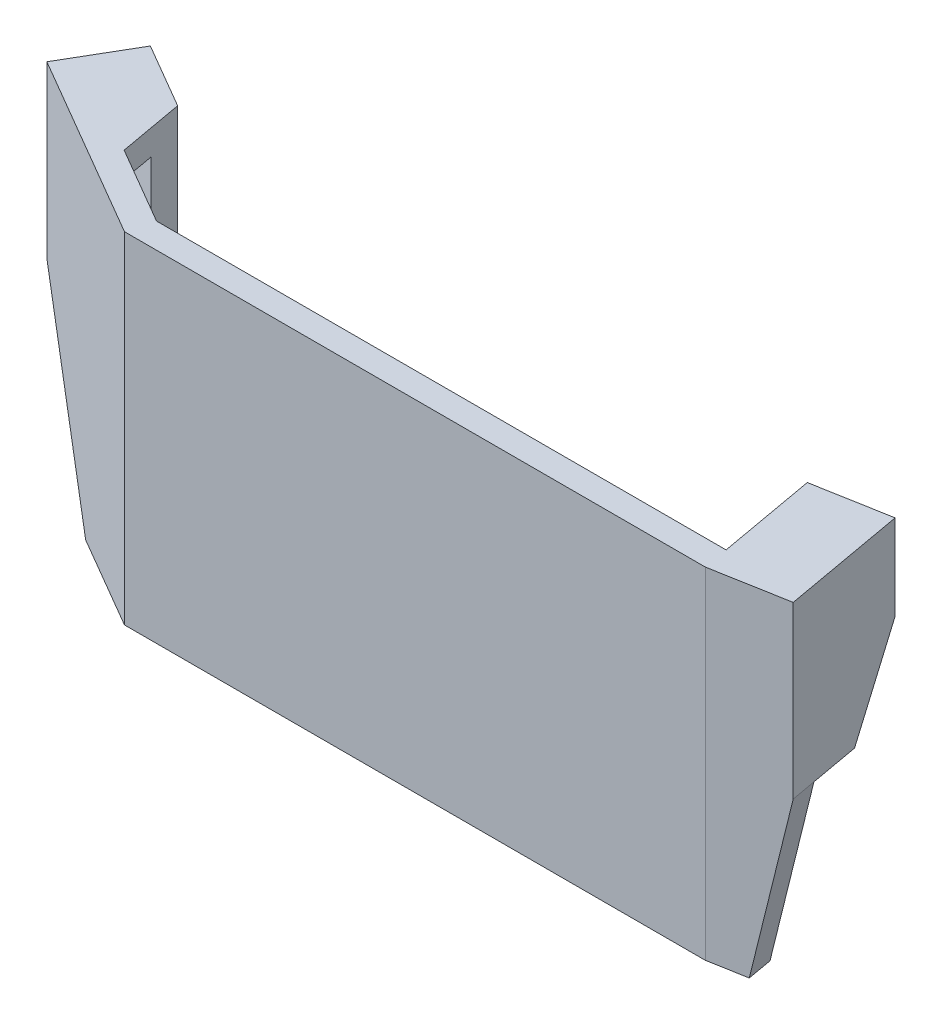
ISO-10303-21;
HEADER;
FILE_DESCRIPTION(('STEP AP214'),'2;1');
FILE_NAME('part.step','',(''),(''),'','','');
FILE_SCHEMA(('AUTOMOTIVE_DESIGN { 1 0 10303 214 1 1 1 1 }'));
ENDSEC;
DATA;
#1=APPLICATION_CONTEXT('core data for automotive mechanical design processes');
#2=APPLICATION_PROTOCOL_DEFINITION('international standard','automotive_design',2000,#1);
#3=PRODUCT_CONTEXT('',#1,'mechanical');
#4=PRODUCT('Part','Part','',(#3));
#5=PRODUCT_RELATED_PRODUCT_CATEGORY('part','',(#4));
#6=PRODUCT_DEFINITION_FORMATION('','',#4);
#7=PRODUCT_DEFINITION_CONTEXT('part definition',#1,'design');
#8=PRODUCT_DEFINITION('design','',#6,#7);
#9=PRODUCT_DEFINITION_SHAPE('','',#8);
#10=(LENGTH_UNIT() NAMED_UNIT(*) SI_UNIT(.MILLI.,.METRE.));
#11=(NAMED_UNIT(*) PLANE_ANGLE_UNIT() SI_UNIT($,.RADIAN.));
#12=(NAMED_UNIT(*) SI_UNIT($,.STERADIAN.) SOLID_ANGLE_UNIT());
#13=UNCERTAINTY_MEASURE_WITH_UNIT(LENGTH_MEASURE(1.E-05),#10,'distance_accuracy_value','');
#14=(GEOMETRIC_REPRESENTATION_CONTEXT(3) GLOBAL_UNCERTAINTY_ASSIGNED_CONTEXT((#13)) GLOBAL_UNIT_ASSIGNED_CONTEXT((#10,
#11,#12)) REPRESENTATION_CONTEXT('',''));
#15=CARTESIAN_POINT('',(0.,0.,0.));
#16=DIRECTION('',(0.,0.,1.));
#17=DIRECTION('',(1.,0.,0.));
#18=AXIS2_PLACEMENT_3D('',#15,#16,#17);
#19=CARTESIAN_POINT('',(0.,-2.,0.));
#20=DIRECTION('',(0.,-1.,0.));
#21=DIRECTION('',(0.,0.,-1.));
#22=AXIS2_PLACEMENT_3D('',#19,#20,#21);
#23=PLANE('',#22);
#24=DIRECTION('',(-0.50344570110163,0.,0.864026866504907));
#25=VECTOR('',#24,1.);
#26=CARTESIAN_POINT('',(-34.7487526832088,-2.,-13.7751158130893));
#27=LINE('',#26,#25);
#28=CARTESIAN_POINT('',(-35.7556440854121,-2.,-12.0470620800794));
#29=VERTEX_POINT('',#28);
#30=CARTESIAN_POINT('',(-36.7625354876154,-2.,-10.3190083470696));
#31=VERTEX_POINT('',#30);
#32=EDGE_CURVE('E304',#29,#31,#27,.T.);
#33=ORIENTED_EDGE('',*,*,#32,.F.);
#34=DIRECTION('',(-0.864026866504906,0.,-0.503445701101632));
#35=VECTOR('',#34,1.);
#36=CARTESIAN_POINT('',(-35.7556440854121,-2.,-12.0470620800794));
#37=LINE('',#36,#35);
#38=CARTESIAN_POINT('',(-29.1011783824715,-2.,-8.16968015927702));
#39=VERTEX_POINT('',#38);
#40=EDGE_CURVE('E365',#39,#29,#37,.T.);
#41=ORIENTED_EDGE('',*,*,#40,.F.);
#42=DIRECTION('',(-0.176472793536462,0.,-0.984305518191094));
#43=VECTOR('',#42,1.);
#44=CARTESIAN_POINT('',(-29.5645914841794,-2.,-10.7544416064795));
#45=LINE('',#44,#43);
#46=CARTESIAN_POINT('',(-28.6377652807636,-2.,-5.58491871207465));
#47=VERTEX_POINT('',#46);
#48=EDGE_CURVE('E261',#47,#39,#45,.T.);
#49=ORIENTED_EDGE('',*,*,#48,.F.);
#50=DIRECTION('',(0.864026866504909,0.,0.503445701101626));
#51=VECTOR('',#50,1.);
#52=CARTESIAN_POINT('',(-22.4852326944472,-2.,-1.9999999999999));
#53=LINE('',#52,#51);
#54=EDGE_CURVE('E329',#31,#47,#53,.T.);
#55=ORIENTED_EDGE('',*,*,#54,.F.);
#56=EDGE_LOOP('',(#33,#41,#49,#55));
#57=FACE_BOUND('',#56,.T.);
#58=ADVANCED_FACE('F45',(#57),#23,.T.);
#59=DIRECTION('',(-0.984305518191093,0.,0.176472793536464));
#60=VECTOR('',#59,1.);
#61=CARTESIAN_POINT('',(27.1665078734454,-2.,-10.9018919431298));
#62=LINE('',#61,#60);
#63=CARTESIAN_POINT('',(25.1978968370632,-2.,-10.5489463560569));
#64=VERTEX_POINT('',#63);
#65=CARTESIAN_POINT('',(23.229285800681,-2.,-10.1960007689839));
#66=VERTEX_POINT('',#65);
#67=EDGE_CURVE('E300',#64,#66,#62,.T.);
#68=ORIENTED_EDGE('',*,*,#67,.F.);
#69=DIRECTION('',(-0.176472793536465,0.,-0.984305518191093));
#70=VECTOR('',#69,1.);
#71=CARTESIAN_POINT('',(25.1978968370632,-2.,-10.5489463560569));
#72=LINE('',#71,#70);
#73=CARTESIAN_POINT('',(26.6040515650291,-2.,-2.7058911721351));
#74=VERTEX_POINT('',#73);
#75=EDGE_CURVE('E360',#74,#64,#72,.T.);
#76=ORIENTED_EDGE('',*,*,#75,.F.);
#77=DIRECTION('',(0.984305518191093,0.,-0.176472793536463));
#78=VECTOR('',#77,1.);
#79=CARTESIAN_POINT('',(28.5726626014113,-2.,-3.05883675920802));
#80=LINE('',#79,#78);
#81=CARTESIAN_POINT('',(24.6354405286469,-2.,-2.35294558506218));
#82=VERTEX_POINT('',#81);
#83=EDGE_CURVE('E320',#82,#74,#80,.T.);
#84=ORIENTED_EDGE('',*,*,#83,.F.);
#85=DIRECTION('',(0.176472793536464,0.,0.984305518191093));
#86=VECTOR('',#85,1.);
#87=CARTESIAN_POINT('',(23.229285800681,-2.,-10.1960007689839));
#88=LINE('',#87,#86);
#89=EDGE_CURVE('E325',#66,#82,#88,.T.);
#90=ORIENTED_EDGE('',*,*,#89,.F.);
#91=EDGE_LOOP('',(#68,#76,#84,#90));
#92=FACE_BOUND('',#91,.T.);
#93=ADVANCED_FACE('F546',(#92),#23,.T.);
#94=CARTESIAN_POINT('',(28.5726626014113,-27.,-3.05883675920802));
#95=DIRECTION('',(0.176472793536463,0.,0.984305518191093));
#96=DIRECTION('',(0.984305518191094,0.,-0.176472793536463));
#97=AXIS2_PLACEMENT_3D('',#94,#95,#96);
#98=PLANE('',#97);
#99=DIRECTION('',(-0.984305518191094,0.,0.176472793536459));
#100=VECTOR('',#99,1.);
#101=CARTESIAN_POINT('',(26.6040515650291,-13.5,-2.7058911721351));
#102=LINE('',#101,#100);
#103=CARTESIAN_POINT('',(28.5726626014113,-13.5,-3.05883675920802));
#104=VERTEX_POINT('',#103);
#105=CARTESIAN_POINT('',(26.6040515650291,-13.5,-2.7058911721351));
#106=VERTEX_POINT('',#105);
#107=EDGE_CURVE('E369',#104,#106,#102,.T.);
#108=ORIENTED_EDGE('',*,*,#107,.F.);
#109=DIRECTION('',(0.213525846694621,0.976187060183953,-0.0382823238944017));
#110=VECTOR('',#109,1.);
#111=CARTESIAN_POINT('',(28.5726626014113,-13.5,-3.05883675920802));
#112=LINE('',#111,#110);
#113=CARTESIAN_POINT('',(25.619746046838,-27.,-2.52941837859864));
#114=VERTEX_POINT('',#113);
#115=EDGE_CURVE('E407',#114,#104,#112,.T.);
#116=ORIENTED_EDGE('',*,*,#115,.F.);
#117=DIRECTION('',(0.984305518191093,0.,-0.176472793536463));
#118=VECTOR('',#117,1.);
#119=CARTESIAN_POINT('',(28.5726626014113,-27.,-3.05883675920802));
#120=LINE('',#119,#118);
#121=CARTESIAN_POINT('',(22.6668294922647,-27.,-1.99999999798924));
#122=VERTEX_POINT('',#121);
#123=EDGE_CURVE('E343',#122,#114,#120,.T.);
#124=ORIENTED_EDGE('',*,*,#123,.F.);
#125=DIRECTION('',(0.,1.,0.));
#126=VECTOR('',#125,1.);
#127=CARTESIAN_POINT('',(22.6668294919042,-2.,-1.99999999999996));
#128=LINE('',#127,#126);
#129=CARTESIAN_POINT('',(22.6668294922647,-13.5,-1.99999999798924));
#130=VERTEX_POINT('',#129);
#131=EDGE_CURVE('E55',#122,#130,#128,.T.);
#132=ORIENTED_EDGE('',*,*,#131,.T.);
#133=DIRECTION('',(0.984305518191093,0.,-0.176472793536464));
#134=VECTOR('',#133,1.);
#135=CARTESIAN_POINT('',(7.23673658171905,-13.5,0.766408957489697));
#136=LINE('',#135,#134);
#137=CARTESIAN_POINT('',(24.6354405286469,-13.5,-2.35294558506217));
#138=VERTEX_POINT('',#137);
#139=EDGE_CURVE('E421',#130,#138,#136,.T.);
#140=ORIENTED_EDGE('',*,*,#139,.T.);
#141=DIRECTION('',(0.,1.,0.));
#142=VECTOR('',#141,1.);
#143=CARTESIAN_POINT('',(24.6354405286469,-27.,-2.35294558506218));
#144=LINE('',#143,#142);
#145=EDGE_CURVE('E316',#138,#82,#144,.T.);
#146=ORIENTED_EDGE('',*,*,#145,.T.);
#147=ORIENTED_EDGE('',*,*,#83,.T.);
#148=DIRECTION('',(0.,1.,0.));
#149=VECTOR('',#148,1.);
#150=CARTESIAN_POINT('',(26.6040515650291,-13.5,-2.7058911721351));
#151=LINE('',#150,#149);
#152=EDGE_CURVE('E332',#106,#74,#151,.T.);
#153=ORIENTED_EDGE('',*,*,#152,.F.);
#154=EDGE_LOOP('',(#108,#116,#124,#132,#140,#146,#147,#153));
#155=FACE_BOUND('',#154,.T.);
#156=ADVANCED_FACE('F511',(#155),#98,.F.);
#157=CARTESIAN_POINT('',(-28.6377652807636,-2.,-5.58491871207465));
#158=DIRECTION('',(0.50344570110163,0.,-0.864026866504907));
#159=DIRECTION('',(-0.864026866504907,0.,-0.50344570110163));
#160=AXIS2_PLACEMENT_3D('',#157,#158,#159);
#161=PLANE('',#160);
#162=DIRECTION('',(-0.461610143904346,0.845323754537753,-0.268968074422982));
#163=VECTOR('',#162,1.);
#164=CARTESIAN_POINT('',(-29.3905233925378,-27.,-6.02353104003977));
#165=LINE('',#164,#163);
#166=CARTESIAN_POINT('',(-29.3905233925379,-27.,-6.02353104003966));
#167=VERTEX_POINT('',#166);
#168=CARTESIAN_POINT('',(-36.7625354876154,-13.5,-10.3190083470697));
#169=VERTEX_POINT('',#168);
#170=EDGE_CURVE('E400',#167,#169,#165,.T.);
#171=ORIENTED_EDGE('',*,*,#170,.T.);
#172=DIRECTION('',(0.,1.,0.));
#173=VECTOR('',#172,1.);
#174=CARTESIAN_POINT('',(-36.7625354876154,-27.,-10.3190083470696));
#175=LINE('',#174,#173);
#176=EDGE_CURVE('E299',#169,#31,#175,.T.);
#177=ORIENTED_EDGE('',*,*,#176,.T.);
#178=ORIENTED_EDGE('',*,*,#54,.T.);
#179=DIRECTION('',(0.,1.,0.));
#180=VECTOR('',#179,1.);
#181=CARTESIAN_POINT('',(-28.6377652807636,-2.,-5.58491871207465));
#182=LINE('',#181,#180);
#183=CARTESIAN_POINT('',(-28.6377652807636,0.,-5.58491871207465));
#184=VERTEX_POINT('',#183);
#185=EDGE_CURVE('E49',#47,#184,#182,.T.);
#186=ORIENTED_EDGE('',*,*,#185,.T.);
#187=DIRECTION('',(-0.864026866504907,0.,-0.50344570110163));
#188=VECTOR('',#187,1.);
#189=CARTESIAN_POINT('',(-28.6377652807636,0.,-5.58491871207465));
#190=LINE('',#189,#188);
#191=CARTESIAN_POINT('',(-22.4852326944472,0.,-2.));
#192=VERTEX_POINT('',#191);
#193=EDGE_CURVE('E295',#192,#184,#190,.T.);
#194=ORIENTED_EDGE('',*,*,#193,.F.);
#195=DIRECTION('',(0.,1.,0.));
#196=VECTOR('',#195,1.);
#197=CARTESIAN_POINT('',(-22.4852326944472,-2.,-2.));
#198=LINE('',#197,#196);
#199=CARTESIAN_POINT('',(-22.4852326944472,-27.,-1.9999999999999));
#200=VERTEX_POINT('',#199);
#201=EDGE_CURVE('E11',#200,#192,#198,.T.);
#202=ORIENTED_EDGE('',*,*,#201,.F.);
#203=DIRECTION('',(0.864026866504905,0.,0.503445701101633));
#204=VECTOR('',#203,1.);
#205=CARTESIAN_POINT('',(-28.6377652807636,-27.,-5.58491871207452));
#206=LINE('',#205,#204);
#207=EDGE_CURVE('E324',#167,#200,#206,.T.);
#208=ORIENTED_EDGE('',*,*,#207,.F.);
#209=EDGE_LOOP('',(#171,#177,#178,#186,#194,#202,#208));
#210=FACE_BOUND('',#209,.T.);
#211=ADVANCED_FACE('F47',(#210),#161,.T.);
#212=CARTESIAN_POINT('',(-22.4852326944472,-2.,-2.));
#213=DIRECTION('',(0.,0.,-1.));
#214=DIRECTION('',(-1.,0.,0.));
#215=AXIS2_PLACEMENT_3D('',#212,#213,#214);
#216=PLANE('',#215);
#217=DIRECTION('',(-1.,0.,0.));
#218=VECTOR('',#217,1.);
#219=CARTESIAN_POINT('',(-22.4852326944472,0.,-2.));
#220=LINE('',#219,#218);
#221=CARTESIAN_POINT('',(22.6668294919042,0.,-1.99999999999996));
#222=VERTEX_POINT('',#221);
#223=EDGE_CURVE('E257',#222,#192,#220,.T.);
#224=ORIENTED_EDGE('',*,*,#223,.F.);
#225=EDGE_CURVE('E253',#130,#222,#128,.T.);
#226=ORIENTED_EDGE('',*,*,#225,.F.);
#227=ORIENTED_EDGE('',*,*,#131,.F.);
#228=DIRECTION('',(1.,0.,0.));
#229=VECTOR('',#228,1.);
#230=CARTESIAN_POINT('',(-22.4852326944472,-27.,-1.9999999999999));
#231=LINE('',#230,#229);
#232=EDGE_CURVE('E347',#200,#122,#231,.T.);
#233=ORIENTED_EDGE('',*,*,#232,.F.);
#234=ORIENTED_EDGE('',*,*,#201,.T.);
#235=EDGE_LOOP('',(#224,#226,#227,#233,#234));
#236=FACE_BOUND('',#235,.T.);
#237=ADVANCED_FACE('F516',(#236),#216,.T.);
#238=CARTESIAN_POINT('',(22.6668294919042,-2.,-1.99999999999996));
#239=DIRECTION('',(-0.984305518191094,0.,0.176472793536463));
#240=DIRECTION('',(0.176472793536463,0.,0.984305518191094));
#241=AXIS2_PLACEMENT_3D('',#238,#239,#240);
#242=PLANE('',#241);
#243=DIRECTION('',(0.0897004228160781,-0.86118240328275,0.50031860091622));
#244=VECTOR('',#243,1.);
#245=CARTESIAN_POINT('',(21.9637521282818,-13.5,-5.92152758995014));
#246=LINE('',#245,#244);
#247=CARTESIAN_POINT('',(21.2606747642988,-6.75,-9.84305518191102));
#248=VERTEX_POINT('',#247);
#249=CARTESIAN_POINT('',(21.9637521282818,-13.5,-5.92152758995014));
#250=VERTEX_POINT('',#249);
#251=EDGE_CURVE('E443',#248,#250,#246,.T.);
#252=ORIENTED_EDGE('',*,*,#251,.T.);
#253=DIRECTION('',(0.176472793536463,0.,0.984305518191094));
#254=VECTOR('',#253,1.);
#255=CARTESIAN_POINT('',(22.6668294922647,-13.5,-1.99999999798922));
#256=LINE('',#255,#254);
#257=EDGE_CURVE('E425',#250,#130,#256,.T.);
#258=ORIENTED_EDGE('',*,*,#257,.T.);
#259=ORIENTED_EDGE('',*,*,#225,.T.);
#260=DIRECTION('',(0.176472793536463,0.,0.984305518191094));
#261=VECTOR('',#260,1.);
#262=CARTESIAN_POINT('',(22.6668294919042,0.,-1.99999999999996));
#263=LINE('',#262,#261);
#264=CARTESIAN_POINT('',(21.2606747642988,0.,-9.84305518191101));
#265=VERTEX_POINT('',#264);
#266=EDGE_CURVE('E262',#265,#222,#263,.T.);
#267=ORIENTED_EDGE('',*,*,#266,.F.);
#268=DIRECTION('',(0.,1.,0.));
#269=VECTOR('',#268,1.);
#270=CARTESIAN_POINT('',(21.2606747642988,-2.,-9.84305518191101));
#271=LINE('',#270,#269);
#272=EDGE_CURVE('E250',#248,#265,#271,.T.);
#273=ORIENTED_EDGE('',*,*,#272,.F.);
#274=EDGE_LOOP('',(#252,#258,#259,#267,#273));
#275=FACE_BOUND('',#274,.T.);
#276=ADVANCED_FACE('F519',(#275),#242,.T.);
#277=CARTESIAN_POINT('',(27.1665078734454,-2.,-10.9018919431298));
#278=DIRECTION('',(-0.176472793536464,0.,-0.984305518191093));
#279=DIRECTION('',(-0.984305518191093,0.,0.176472793536464));
#280=AXIS2_PLACEMENT_3D('',#277,#278,#279);
#281=PLANE('',#280);
#282=DIRECTION('',(0.984305518191094,0.,-0.176472793536462));
#283=VECTOR('',#282,1.);
#284=CARTESIAN_POINT('',(13.545628309026,-6.75,-8.45985070417156));
#285=LINE('',#284,#283);
#286=CARTESIAN_POINT('',(23.229285800681,-6.75,-10.1960007689839));
#287=VERTEX_POINT('',#286);
#288=EDGE_CURVE('E440',#248,#287,#285,.T.);
#289=ORIENTED_EDGE('',*,*,#288,.F.);
#290=ORIENTED_EDGE('',*,*,#272,.T.);
#291=DIRECTION('',(-0.984305518191093,0.,0.176472793536464));
#292=VECTOR('',#291,1.);
#293=CARTESIAN_POINT('',(27.1665078734454,0.,-10.9018919431298));
#294=LINE('',#293,#292);
#295=CARTESIAN_POINT('',(27.1665078734454,0.,-10.9018919431298));
#296=VERTEX_POINT('',#295);
#297=EDGE_CURVE('E266',#296,#265,#294,.T.);
#298=ORIENTED_EDGE('',*,*,#297,.F.);
#299=DIRECTION('',(0.,1.,0.));
#300=VECTOR('',#299,1.);
#301=CARTESIAN_POINT('',(27.1665078734454,-2.,-10.9018919431298));
#302=LINE('',#301,#300);
#303=CARTESIAN_POINT('',(27.1665078734454,-6.75,-10.9018919431298));
#304=VERTEX_POINT('',#303);
#305=EDGE_CURVE('E247',#304,#296,#302,.T.);
#306=ORIENTED_EDGE('',*,*,#305,.F.);
#307=CARTESIAN_POINT('',(25.1978968370632,-6.75,-10.5489463560569));
#308=VERTEX_POINT('',#307);
#309=EDGE_CURVE('E444',#308,#304,#285,.T.);
#310=ORIENTED_EDGE('',*,*,#309,.F.);
#311=DIRECTION('',(0.,1.,0.));
#312=VECTOR('',#311,1.);
#313=CARTESIAN_POINT('',(25.1978968370632,-13.5,-10.5489463560569));
#314=LINE('',#313,#312);
#315=EDGE_CURVE('E356',#308,#64,#314,.T.);
#316=ORIENTED_EDGE('',*,*,#315,.T.);
#317=ORIENTED_EDGE('',*,*,#67,.T.);
#318=DIRECTION('',(0.,1.,0.));
#319=VECTOR('',#318,1.);
#320=CARTESIAN_POINT('',(23.229285800681,-27.,-10.1960007689839));
#321=LINE('',#320,#319);
#322=EDGE_CURVE('E313',#287,#66,#321,.T.);
#323=ORIENTED_EDGE('',*,*,#322,.F.);
#324=EDGE_LOOP('',(#289,#290,#298,#306,#310,#316,#317,#323));
#325=FACE_BOUND('',#324,.T.);
#326=ADVANCED_FACE('F490',(#325),#281,.T.);
#327=CARTESIAN_POINT('',(28.93123580881,-2.,-1.05883676121875));
#328=DIRECTION('',(0.984305518191094,0.,-0.176472793536462));
#329=DIRECTION('',(-0.176472793536462,0.,-0.984305518191094));
#330=AXIS2_PLACEMENT_3D('',#327,#328,#329);
#331=PLANE('',#330);
#332=DIRECTION('',(0.0897004228160776,-0.86118240328275,0.50031860091622));
#333=VECTOR('',#332,1.);
#334=CARTESIAN_POINT('',(27.8695852374283,-13.5,-6.9803643511689));
#335=LINE('',#334,#333);
#336=CARTESIAN_POINT('',(27.8695852374283,-13.5,-6.9803643511689));
#337=VERTEX_POINT('',#336);
#338=EDGE_CURVE('E71',#304,#337,#335,.T.);
#339=ORIENTED_EDGE('',*,*,#338,.F.);
#340=ORIENTED_EDGE('',*,*,#305,.T.);
#341=DIRECTION('',(-0.176472793536462,0.,-0.984305518191093));
#342=VECTOR('',#341,1.);
#343=CARTESIAN_POINT('',(28.93123580881,0.,-1.05883676121875));
#344=LINE('',#343,#342);
#345=CARTESIAN_POINT('',(28.93123580881,0.,-1.05883676121875));
#346=VERTEX_POINT('',#345);
#347=EDGE_CURVE('E270',#346,#296,#344,.T.);
#348=ORIENTED_EDGE('',*,*,#347,.F.);
#349=DIRECTION('',(0.,1.,0.));
#350=VECTOR('',#349,1.);
#351=CARTESIAN_POINT('',(28.93123580881,-2.,-1.05883676121875));
#352=LINE('',#351,#350);
#353=CARTESIAN_POINT('',(28.93123580881,-13.5,-1.05883676121875));
#354=VERTEX_POINT('',#353);
#355=EDGE_CURVE('E244',#354,#346,#352,.T.);
#356=ORIENTED_EDGE('',*,*,#355,.F.);
#357=DIRECTION('',(0.176472793536463,0.,0.984305518191093));
#358=VECTOR('',#357,1.);
#359=CARTESIAN_POINT('',(26.1321644531431,-13.5,-16.6711094859903));
#360=LINE('',#359,#358);
#361=EDGE_CURVE('E412',#104,#354,#360,.T.);
#362=ORIENTED_EDGE('',*,*,#361,.F.);
#363=DIRECTION('',(0.176472793536459,0.,0.984305518191094));
#364=VECTOR('',#363,1.);
#365=CARTESIAN_POINT('',(28.5726626014112,-13.5,-3.05883675920801));
#366=LINE('',#365,#364);
#367=EDGE_CURVE('E364',#337,#104,#366,.T.);
#368=ORIENTED_EDGE('',*,*,#367,.F.);
#369=EDGE_LOOP('',(#339,#340,#348,#356,#362,#368));
#370=FACE_BOUND('',#369,.T.);
#371=ADVANCED_FACE('F485',(#370),#331,.T.);
#372=CARTESIAN_POINT('',(23.0254026996635,-2.,0.));
#373=DIRECTION('',(0.176472793536463,0.,0.984305518191094));
#374=DIRECTION('',(0.984305518191094,0.,-0.176472793536463));
#375=AXIS2_PLACEMENT_3D('',#372,#373,#374);
#376=PLANE('',#375);
#377=DIRECTION('',(-0.213525846694621,-0.976187060183953,0.0382823238944016));
#378=VECTOR('',#377,1.);
#379=CARTESIAN_POINT('',(28.93123580881,-13.5,-1.05883676121875));
#380=LINE('',#379,#378);
#381=CARTESIAN_POINT('',(25.9783192542368,-27.,-0.529418380609374));
#382=VERTEX_POINT('',#381);
#383=EDGE_CURVE('E415',#354,#382,#380,.T.);
#384=ORIENTED_EDGE('',*,*,#383,.F.);
#385=ORIENTED_EDGE('',*,*,#355,.T.);
#386=DIRECTION('',(0.984305518191093,0.,-0.176472793536463));
#387=VECTOR('',#386,1.);
#388=CARTESIAN_POINT('',(23.0254026996635,0.,0.));
#389=LINE('',#388,#387);
#390=CARTESIAN_POINT('',(23.0254026996635,0.,0.));
#391=VERTEX_POINT('',#390);
#392=EDGE_CURVE('E274',#391,#346,#389,.T.);
#393=ORIENTED_EDGE('',*,*,#392,.F.);
#394=DIRECTION('',(0.,1.,0.));
#395=VECTOR('',#394,1.);
#396=CARTESIAN_POINT('',(23.0254026996635,-2.,0.));
#397=LINE('',#396,#395);
#398=CARTESIAN_POINT('',(23.0254026996635,-27.,0.));
#399=VERTEX_POINT('',#398);
#400=EDGE_CURVE('E241',#399,#391,#397,.T.);
#401=ORIENTED_EDGE('',*,*,#400,.F.);
#402=DIRECTION('',(-0.984305518191093,0.,0.176472793536463));
#403=VECTOR('',#402,1.);
#404=CARTESIAN_POINT('',(23.0254026996635,-27.,0.));
#405=LINE('',#404,#403);
#406=EDGE_CURVE('E340',#382,#399,#405,.T.);
#407=ORIENTED_EDGE('',*,*,#406,.F.);
#408=EDGE_LOOP('',(#384,#385,#393,#401,#407));
#409=FACE_BOUND('',#408,.T.);
#410=ADVANCED_FACE('F500',(#409),#376,.T.);
#411=CARTESIAN_POINT('',(23.0254026996635,-2.,0.));
#412=DIRECTION('',(0.,0.,1.));
#413=DIRECTION('',(1.,0.,0.));
#414=AXIS2_PLACEMENT_3D('',#411,#412,#413);
#415=PLANE('',#414);
#416=DIRECTION('',(1.,0.,0.));
#417=VECTOR('',#416,1.);
#418=CARTESIAN_POINT('',(23.0254026996635,0.,0.));
#419=LINE('',#418,#417);
#420=CARTESIAN_POINT('',(-23.0254026996635,0.,0.));
#421=VERTEX_POINT('',#420);
#422=EDGE_CURVE('E278',#421,#391,#419,.T.);
#423=ORIENTED_EDGE('',*,*,#422,.F.);
#424=DIRECTION('',(0.,1.,0.));
#425=VECTOR('',#424,1.);
#426=CARTESIAN_POINT('',(-23.0254026996635,-2.,0.));
#427=LINE('',#426,#425);
#428=CARTESIAN_POINT('',(-23.0254026996635,-27.,0.));
#429=VERTEX_POINT('',#428);
#430=EDGE_CURVE('E236',#429,#421,#427,.T.);
#431=ORIENTED_EDGE('',*,*,#430,.F.);
#432=DIRECTION('',(-1.,0.,0.));
#433=VECTOR('',#432,1.);
#434=CARTESIAN_POINT('',(-23.0254026996635,-27.,0.));
#435=LINE('',#434,#433);
#436=EDGE_CURVE('E336',#399,#429,#435,.T.);
#437=ORIENTED_EDGE('',*,*,#436,.F.);
#438=ORIENTED_EDGE('',*,*,#400,.T.);
#439=EDGE_LOOP('',(#423,#431,#437,#438));
#440=FACE_BOUND('',#439,.T.);
#441=ADVANCED_FACE('F535',(#440),#415,.T.);
#442=CARTESIAN_POINT('',(-37.7694268898186,-2.,-8.59095461405988));
#443=DIRECTION('',(-0.50344570110163,0.,0.864026866504907));
#444=DIRECTION('',(0.864026866504907,0.,0.50344570110163));
#445=AXIS2_PLACEMENT_3D('',#442,#443,#444);
#446=PLANE('',#445);
#447=DIRECTION('',(-0.461610143904346,0.845323754537753,-0.268968074422982));
#448=VECTOR('',#447,1.);
#449=CARTESIAN_POINT('',(-30.3974147947411,-27.,-4.29547730702995));
#450=LINE('',#449,#448);
#451=CARTESIAN_POINT('',(-30.3974147947411,-27.,-4.29547730702995));
#452=VERTEX_POINT('',#451);
#453=CARTESIAN_POINT('',(-37.7694268898186,-13.5,-8.59095461405987));
#454=VERTEX_POINT('',#453);
#455=EDGE_CURVE('E404',#452,#454,#450,.T.);
#456=ORIENTED_EDGE('',*,*,#455,.F.);
#457=DIRECTION('',(-0.864026866504907,0.,-0.50344570110163));
#458=VECTOR('',#457,1.);
#459=CARTESIAN_POINT('',(-37.7694268898186,-27.,-8.59095461405988));
#460=LINE('',#459,#458);
#461=EDGE_CURVE('E319',#429,#452,#460,.T.);
#462=ORIENTED_EDGE('',*,*,#461,.F.);
#463=ORIENTED_EDGE('',*,*,#430,.T.);
#464=DIRECTION('',(0.864026866504907,0.,0.50344570110163));
#465=VECTOR('',#464,1.);
#466=CARTESIAN_POINT('',(-37.7694268898186,0.,-8.59095461405988));
#467=LINE('',#466,#465);
#468=CARTESIAN_POINT('',(-37.7694268898186,0.,-8.59095461405988));
#469=VERTEX_POINT('',#468);
#470=EDGE_CURVE('E282',#469,#421,#467,.T.);
#471=ORIENTED_EDGE('',*,*,#470,.F.);
#472=DIRECTION('',(0.,1.,0.));
#473=VECTOR('',#472,1.);
#474=CARTESIAN_POINT('',(-37.7694268898186,-2.,-8.59095461405988));
#475=LINE('',#474,#473);
#476=EDGE_CURVE('E231',#454,#469,#475,.T.);
#477=ORIENTED_EDGE('',*,*,#476,.F.);
#478=EDGE_LOOP('',(#456,#462,#463,#471,#477));
#479=FACE_BOUND('',#478,.T.);
#480=ADVANCED_FACE('F530',(#479),#446,.T.);
#481=CARTESIAN_POINT('',(-34.7487526832088,-2.,-13.7751158130893));
#482=DIRECTION('',(-0.864026866504907,0.,-0.50344570110163));
#483=DIRECTION('',(-0.50344570110163,0.,0.864026866504907));
#484=AXIS2_PLACEMENT_3D('',#481,#482,#483);
#485=PLANE('',#484);
#486=DIRECTION('',(0.50344570110163,0.,-0.864026866504907));
#487=VECTOR('',#486,1.);
#488=CARTESIAN_POINT('',(-39.4744179262187,-6.75,-5.66480377122573));
#489=LINE('',#488,#487);
#490=CARTESIAN_POINT('',(-35.7556440854121,-6.75,-12.0470620800795));
#491=VERTEX_POINT('',#490);
#492=CARTESIAN_POINT('',(-34.7487526832088,-6.75,-13.7751158130893));
#493=VERTEX_POINT('',#492);
#494=EDGE_CURVE('E206',#491,#493,#489,.T.);
#495=ORIENTED_EDGE('',*,*,#494,.F.);
#496=DIRECTION('',(0.,1.,0.));
#497=VECTOR('',#496,1.);
#498=CARTESIAN_POINT('',(-35.7556440854121,-13.5,-12.0470620800794));
#499=LINE('',#498,#497);
#500=EDGE_CURVE('E384',#491,#29,#499,.T.);
#501=ORIENTED_EDGE('',*,*,#500,.T.);
#502=ORIENTED_EDGE('',*,*,#32,.T.);
#503=ORIENTED_EDGE('',*,*,#176,.F.);
#504=DIRECTION('',(-0.50344570110163,0.,0.864026866504907));
#505=VECTOR('',#504,1.);
#506=CARTESIAN_POINT('',(-28.722400653609,-13.5,-24.1177010197897));
#507=LINE('',#506,#505);
#508=EDGE_CURVE('E396',#169,#454,#507,.T.);
#509=ORIENTED_EDGE('',*,*,#508,.T.);
#510=ORIENTED_EDGE('',*,*,#476,.T.);
#511=DIRECTION('',(-0.50344570110163,0.,0.864026866504907));
#512=VECTOR('',#511,1.);
#513=CARTESIAN_POINT('',(-34.7487526832088,0.,-13.7751158130893));
#514=LINE('',#513,#512);
#515=CARTESIAN_POINT('',(-34.7487526832088,0.,-13.7751158130893));
#516=VERTEX_POINT('',#515);
#517=EDGE_CURVE('E228',#516,#469,#514,.T.);
#518=ORIENTED_EDGE('',*,*,#517,.F.);
#519=DIRECTION('',(0.,1.,0.));
#520=VECTOR('',#519,1.);
#521=CARTESIAN_POINT('',(-34.7487526832088,-2.,-13.7751158130893));
#522=LINE('',#521,#520);
#523=EDGE_CURVE('E220',#493,#516,#522,.T.);
#524=ORIENTED_EDGE('',*,*,#523,.F.);
#525=EDGE_LOOP('',(#495,#501,#502,#503,#509,#510,#518,#524));
#526=FACE_BOUND('',#525,.T.);
#527=ADVANCED_FACE('F226',(#526),#485,.T.);
#528=CARTESIAN_POINT('',(-29.5645914841794,-2.,-10.7544416064795));
#529=DIRECTION('',(0.50344570110163,0.,-0.864026866504907));
#530=DIRECTION('',(-0.864026866504907,0.,-0.50344570110163));
#531=AXIS2_PLACEMENT_3D('',#528,#529,#530);
#532=PLANE('',#531);
#533=DIRECTION('',(0.350914546191269,-0.913811548620258,0.204468664786618));
#534=VECTOR('',#533,1.);
#535=CARTESIAN_POINT('',(-34.7487526832088,-6.75,-13.7751158130893));
#536=LINE('',#535,#534);
#537=CARTESIAN_POINT('',(-32.1566720836941,-13.5,-12.2647787097844));
#538=VERTEX_POINT('',#537);
#539=EDGE_CURVE('E63',#493,#538,#536,.T.);
#540=ORIENTED_EDGE('',*,*,#539,.F.);
#541=ORIENTED_EDGE('',*,*,#523,.T.);
#542=DIRECTION('',(-0.864026866504907,0.,-0.50344570110163));
#543=VECTOR('',#542,1.);
#544=CARTESIAN_POINT('',(-29.5645914841794,0.,-10.7544416064795));
#545=LINE('',#544,#543);
#546=CARTESIAN_POINT('',(-29.5645914841794,0.,-10.7544416064795));
#547=VERTEX_POINT('',#546);
#548=EDGE_CURVE('E288',#547,#516,#545,.T.);
#549=ORIENTED_EDGE('',*,*,#548,.F.);
#550=DIRECTION('',(0.,1.,0.));
#551=VECTOR('',#550,1.);
#552=CARTESIAN_POINT('',(-29.5645914841794,-2.,-10.7544416064795));
#553=LINE('',#552,#551);
#554=CARTESIAN_POINT('',(-29.5645914841794,-13.5,-10.7544416064795));
#555=VERTEX_POINT('',#554);
#556=EDGE_CURVE('E232',#555,#547,#553,.T.);
#557=ORIENTED_EDGE('',*,*,#556,.F.);
#558=DIRECTION('',(0.864026866504907,0.,0.503445701101629));
#559=VECTOR('',#558,1.);
#560=CARTESIAN_POINT('',(-29.5645914841794,-13.5,-10.7544416064795));
#561=LINE('',#560,#559);
#562=EDGE_CURVE('E223',#538,#555,#561,.T.);
#563=ORIENTED_EDGE('',*,*,#562,.F.);
#564=EDGE_LOOP('',(#540,#541,#549,#557,#563));
#565=FACE_BOUND('',#564,.T.);
#566=ADVANCED_FACE('F218',(#565),#532,.T.);
#567=CARTESIAN_POINT('',(-29.5645914841794,-2.,-10.7544416064795));
#568=DIRECTION('',(0.984305518191094,0.,-0.176472793536462));
#569=DIRECTION('',(-0.176472793536462,0.,-0.984305518191094));
#570=AXIS2_PLACEMENT_3D('',#567,#568,#569);
#571=PLANE('',#570);
#572=DIRECTION('',(-0.176472793536462,0.,-0.984305518191094));
#573=VECTOR('',#572,1.);
#574=CARTESIAN_POINT('',(-29.5645914841794,0.,-10.7544416064795));
#575=LINE('',#574,#573);
#576=EDGE_CURVE('E291',#184,#547,#575,.T.);
#577=ORIENTED_EDGE('',*,*,#576,.F.);
#578=ORIENTED_EDGE('',*,*,#185,.F.);
#579=ORIENTED_EDGE('',*,*,#48,.T.);
#580=DIRECTION('',(0.,1.,0.));
#581=VECTOR('',#580,1.);
#582=CARTESIAN_POINT('',(-29.1011783824715,-13.5,-8.16968015927702));
#583=LINE('',#582,#581);
#584=CARTESIAN_POINT('',(-29.1011783824715,-13.5,-8.16968015927702));
#585=VERTEX_POINT('',#584);
#586=EDGE_CURVE('E390',#585,#39,#583,.T.);
#587=ORIENTED_EDGE('',*,*,#586,.F.);
#588=DIRECTION('',(0.176472793536451,0.,0.984305518191095));
#589=VECTOR('',#588,1.);
#590=CARTESIAN_POINT('',(-29.1011783824715,-13.5,-8.16968015927702));
#591=LINE('',#590,#589);
#592=EDGE_CURVE('E377',#555,#585,#591,.T.);
#593=ORIENTED_EDGE('',*,*,#592,.F.);
#594=ORIENTED_EDGE('',*,*,#556,.T.);
#595=EDGE_LOOP('',(#577,#578,#579,#587,#593,#594));
#596=FACE_BOUND('',#595,.T.);
#597=ADVANCED_FACE('F473',(#596),#571,.T.);
#598=CARTESIAN_POINT('',(0.,0.,0.));
#599=DIRECTION('',(0.,-1.,0.));
#600=DIRECTION('',(0.,0.,-1.));
#601=AXIS2_PLACEMENT_3D('',#598,#599,#600);
#602=PLANE('',#601);
#603=ORIENTED_EDGE('',*,*,#193,.T.);
#604=ORIENTED_EDGE('',*,*,#576,.T.);
#605=ORIENTED_EDGE('',*,*,#548,.T.);
#606=ORIENTED_EDGE('',*,*,#517,.T.);
#607=ORIENTED_EDGE('',*,*,#470,.T.);
#608=ORIENTED_EDGE('',*,*,#422,.T.);
#609=ORIENTED_EDGE('',*,*,#392,.T.);
#610=ORIENTED_EDGE('',*,*,#347,.T.);
#611=ORIENTED_EDGE('',*,*,#297,.T.);
#612=ORIENTED_EDGE('',*,*,#266,.T.);
#613=ORIENTED_EDGE('',*,*,#223,.T.);
#614=EDGE_LOOP('',(#603,#604,#605,#606,#607,#608,#609,#610,#611,#612,#613));
#615=FACE_BOUND('',#614,.T.);
#616=ADVANCED_FACE('F494',(#615),#602,.F.);
#617=CARTESIAN_POINT('',(23.229285800681,-27.,-10.1960007689839));
#618=DIRECTION('',(-0.984305518191093,0.,0.176472793536464));
#619=DIRECTION('',(0.176472793536464,0.,0.984305518191093));
#620=AXIS2_PLACEMENT_3D('',#617,#618,#619);
#621=PLANE('',#620);
#622=DIRECTION('',(0.176472793536464,0.,0.984305518191093));
#623=VECTOR('',#622,1.);
#624=CARTESIAN_POINT('',(24.6354405286469,-13.5,-2.35294558506217));
#625=LINE('',#624,#623);
#626=CARTESIAN_POINT('',(23.932363164664,-13.5,-6.27447317702306));
#627=VERTEX_POINT('',#626);
#628=EDGE_CURVE('E428',#627,#138,#625,.T.);
#629=ORIENTED_EDGE('',*,*,#628,.F.);
#630=DIRECTION('',(-0.0897004228160787,0.86118240328275,-0.50031860091622));
#631=VECTOR('',#630,1.);
#632=CARTESIAN_POINT('',(24.7935664210297,-21.768111417408,-1.47097287231604));
#633=LINE('',#632,#631);
#634=EDGE_CURVE('E431',#627,#287,#633,.T.);
#635=ORIENTED_EDGE('',*,*,#634,.T.);
#636=ORIENTED_EDGE('',*,*,#322,.T.);
#637=ORIENTED_EDGE('',*,*,#89,.T.);
#638=ORIENTED_EDGE('',*,*,#145,.F.);
#639=EDGE_LOOP('',(#629,#635,#636,#637,#638));
#640=FACE_BOUND('',#639,.T.);
#641=ADVANCED_FACE('F554',(#640),#621,.F.);
#642=CARTESIAN_POINT('',(0.,-27.,0.));
#643=DIRECTION('',(0.,1.,0.));
#644=DIRECTION('',(0.,0.,1.));
#645=AXIS2_PLACEMENT_3D('',#642,#643,#644);
#646=PLANE('',#645);
#647=ORIENTED_EDGE('',*,*,#232,.T.);
#648=ORIENTED_EDGE('',*,*,#123,.T.);
#649=DIRECTION('',(0.176472793536463,0.,0.984305518191093));
#650=VECTOR('',#649,1.);
#651=CARTESIAN_POINT('',(23.1792478985699,-27.,-16.1416911053809));
#652=LINE('',#651,#650);
#653=EDGE_CURVE('E411',#114,#382,#652,.T.);
#654=ORIENTED_EDGE('',*,*,#653,.T.);
#655=ORIENTED_EDGE('',*,*,#406,.T.);
#656=ORIENTED_EDGE('',*,*,#436,.T.);
#657=ORIENTED_EDGE('',*,*,#461,.T.);
#658=DIRECTION('',(-0.50344570110163,0.,0.864026866504907));
#659=VECTOR('',#658,1.);
#660=CARTESIAN_POINT('',(-21.3503885585315,-27.,-19.8222237127598));
#661=LINE('',#660,#659);
#662=EDGE_CURVE('E393',#167,#452,#661,.T.);
#663=ORIENTED_EDGE('',*,*,#662,.F.);
#664=ORIENTED_EDGE('',*,*,#207,.T.);
#665=EDGE_LOOP('',(#647,#648,#654,#655,#656,#657,#663,#664));
#666=FACE_BOUND('',#665,.T.);
#667=ADVANCED_FACE('F507',(#666),#646,.F.);
#668=CARTESIAN_POINT('',(25.1978968370632,-13.5,-10.5489463560569));
#669=DIRECTION('',(0.984305518191093,0.,-0.176472793536465));
#670=DIRECTION('',(-0.176472793536465,0.,-0.984305518191093));
#671=AXIS2_PLACEMENT_3D('',#668,#669,#670);
#672=PLANE('',#671);
#673=ORIENTED_EDGE('',*,*,#315,.F.);
#674=DIRECTION('',(0.0897004228160792,-0.86118240328275,0.50031860091622));
#675=VECTOR('',#674,1.);
#676=CARTESIAN_POINT('',(25.7193237105127,-11.756037139136,-7.64060372383423));
#677=LINE('',#676,#675);
#678=CARTESIAN_POINT('',(25.9009742010461,-13.5,-6.62741876409598));
#679=VERTEX_POINT('',#678);
#680=EDGE_CURVE('E435',#308,#679,#677,.T.);
#681=ORIENTED_EDGE('',*,*,#680,.T.);
#682=DIRECTION('',(-0.176472793536465,0.,-0.984305518191093));
#683=VECTOR('',#682,1.);
#684=CARTESIAN_POINT('',(25.1978968370632,-13.5,-10.5489463560569));
#685=LINE('',#684,#683);
#686=EDGE_CURVE('E359',#106,#679,#685,.T.);
#687=ORIENTED_EDGE('',*,*,#686,.F.);
#688=ORIENTED_EDGE('',*,*,#152,.T.);
#689=ORIENTED_EDGE('',*,*,#75,.T.);
#690=EDGE_LOOP('',(#673,#681,#687,#688,#689));
#691=FACE_BOUND('',#690,.T.);
#692=ADVANCED_FACE('F637',(#691),#672,.F.);
#693=CARTESIAN_POINT('',(0.,-13.5,0.));
#694=DIRECTION('',(0.,1.,0.));
#695=DIRECTION('',(0.,0.,1.));
#696=AXIS2_PLACEMENT_3D('',#693,#694,#695);
#697=PLANE('',#696);
#698=ORIENTED_EDGE('',*,*,#686,.T.);
#699=DIRECTION('',(0.984305518191094,0.,-0.176472793536462));
#700=VECTOR('',#699,1.);
#701=CARTESIAN_POINT('',(14.2487056730089,-13.5,-4.53832311221067));
#702=LINE('',#701,#700);
#703=EDGE_CURVE('E448',#679,#337,#702,.T.);
#704=ORIENTED_EDGE('',*,*,#703,.T.);
#705=ORIENTED_EDGE('',*,*,#367,.T.);
#706=ORIENTED_EDGE('',*,*,#107,.T.);
#707=EDGE_LOOP('',(#698,#704,#705,#706));
#708=FACE_BOUND('',#707,.T.);
#709=ADVANCED_FACE('F647',(#708),#697,.F.);
#710=CARTESIAN_POINT('',(-35.7556440854121,-13.5,-12.0470620800794));
#711=DIRECTION('',(0.503445701101632,0.,-0.864026866504906));
#712=DIRECTION('',(-0.864026866504906,0.,-0.503445701101632));
#713=AXIS2_PLACEMENT_3D('',#710,#711,#712);
#714=PLANE('',#713);
#715=ORIENTED_EDGE('',*,*,#500,.F.);
#716=DIRECTION('',(-0.350914546191268,0.913811548620258,-0.204468664786619));
#717=VECTOR('',#716,1.);
#718=CARTESIAN_POINT('',(-35.7556440854121,-6.75000000000001,-12.0470620800795));
#719=LINE('',#718,#717);
#720=CARTESIAN_POINT('',(-33.1635634858974,-13.5,-10.5367249767746));
#721=VERTEX_POINT('',#720);
#722=EDGE_CURVE('E209',#721,#491,#719,.T.);
#723=ORIENTED_EDGE('',*,*,#722,.F.);
#724=DIRECTION('',(-0.864026866504906,0.,-0.503445701101632));
#725=VECTOR('',#724,1.);
#726=CARTESIAN_POINT('',(-35.7556440854121,-13.5,-12.0470620800794));
#727=LINE('',#726,#725);
#728=EDGE_CURVE('E380',#585,#721,#727,.T.);
#729=ORIENTED_EDGE('',*,*,#728,.F.);
#730=ORIENTED_EDGE('',*,*,#586,.T.);
#731=ORIENTED_EDGE('',*,*,#40,.T.);
#732=EDGE_LOOP('',(#715,#723,#729,#730,#731));
#733=FACE_BOUND('',#732,.T.);
#734=ADVANCED_FACE('F461',(#733),#714,.F.);
#735=CARTESIAN_POINT('',(0.,-13.5,0.));
#736=DIRECTION('',(0.,1.,0.));
#737=DIRECTION('',(0.,0.,1.));
#738=AXIS2_PLACEMENT_3D('',#735,#736,#737);
#739=PLANE('',#738);
#740=ORIENTED_EDGE('',*,*,#728,.T.);
#741=DIRECTION('',(0.50344570110163,0.,-0.864026866504907));
#742=VECTOR('',#741,1.);
#743=CARTESIAN_POINT('',(-36.882337326704,-13.5,-4.15446666792085));
#744=LINE('',#743,#742);
#745=EDGE_CURVE('E214',#721,#538,#744,.T.);
#746=ORIENTED_EDGE('',*,*,#745,.T.);
#747=ORIENTED_EDGE('',*,*,#562,.T.);
#748=ORIENTED_EDGE('',*,*,#592,.T.);
#749=EDGE_LOOP('',(#740,#746,#747,#748));
#750=FACE_BOUND('',#749,.T.);
#751=ADVANCED_FACE('F458',(#750),#739,.F.);
#752=CARTESIAN_POINT('',(-21.3503885585315,-27.,-19.8222237127598));
#753=DIRECTION('',(0.730382434815417,0.534254386986384,0.425574610261121));
#754=DIRECTION('',(-0.590386349238916,0.807120783174578,0.));
#755=AXIS2_PLACEMENT_3D('',#752,#753,#754);
#756=PLANE('',#755);
#757=ORIENTED_EDGE('',*,*,#662,.T.);
#758=ORIENTED_EDGE('',*,*,#455,.T.);
#759=ORIENTED_EDGE('',*,*,#508,.F.);
#760=ORIENTED_EDGE('',*,*,#170,.F.);
#761=EDGE_LOOP('',(#757,#758,#759,#760));
#762=FACE_BOUND('',#761,.T.);
#763=ADVANCED_FACE('F527',(#762),#756,.F.);
#764=CARTESIAN_POINT('',(26.1321644531431,-13.5,-16.6711094859903));
#765=DIRECTION('',(-0.960866310125806,0.216930457818654,0.172270457524809));
#766=DIRECTION('',(-0.220222858073588,-0.975449584951421,0.));
#767=AXIS2_PLACEMENT_3D('',#764,#765,#766);
#768=PLANE('',#767);
#769=ORIENTED_EDGE('',*,*,#115,.T.);
#770=ORIENTED_EDGE('',*,*,#361,.T.);
#771=ORIENTED_EDGE('',*,*,#383,.T.);
#772=ORIENTED_EDGE('',*,*,#653,.F.);
#773=EDGE_LOOP('',(#769,#770,#771,#772));
#774=FACE_BOUND('',#773,.T.);
#775=ADVANCED_FACE('F504',(#774),#768,.F.);
#776=CARTESIAN_POINT('',(7.23673658171905,-13.5,0.766408957489697));
#777=DIRECTION('',(0.,1.,0.));
#778=DIRECTION('',(0.,0.,1.));
#779=AXIS2_PLACEMENT_3D('',#776,#777,#778);
#780=PLANE('',#779);
#781=ORIENTED_EDGE('',*,*,#257,.F.);
#782=EDGE_CURVE('E439',#250,#627,#702,.T.);
#783=ORIENTED_EDGE('',*,*,#782,.T.);
#784=ORIENTED_EDGE('',*,*,#628,.T.);
#785=ORIENTED_EDGE('',*,*,#139,.F.);
#786=EDGE_LOOP('',(#781,#783,#784,#785));
#787=FACE_BOUND('',#786,.T.);
#788=ADVANCED_FACE('F689',(#787),#780,.F.);
#789=CARTESIAN_POINT('',(14.2487056730089,-13.5,-4.53832311221067));
#790=DIRECTION('',(0.151975264451751,0.508296043931238,0.847666591720278));
#791=DIRECTION('',(0.,-0.857628550051696,0.5142696473021));
#792=AXIS2_PLACEMENT_3D('',#789,#790,#791);
#793=PLANE('',#792);
#794=ORIENTED_EDGE('',*,*,#782,.F.);
#795=ORIENTED_EDGE('',*,*,#251,.F.);
#796=ORIENTED_EDGE('',*,*,#288,.T.);
#797=ORIENTED_EDGE('',*,*,#634,.F.);
#798=EDGE_LOOP('',(#794,#795,#796,#797));
#799=FACE_BOUND('',#798,.T.);
#800=ADVANCED_FACE('F698',(#799),#793,.F.);
#801=ORIENTED_EDGE('',*,*,#309,.T.);
#802=ORIENTED_EDGE('',*,*,#338,.T.);
#803=ORIENTED_EDGE('',*,*,#703,.F.);
#804=ORIENTED_EDGE('',*,*,#680,.F.);
#805=EDGE_LOOP('',(#801,#802,#803,#804));
#806=FACE_BOUND('',#805,.T.);
#807=ADVANCED_FACE('F479',(#806),#793,.F.);
#808=CARTESIAN_POINT('',(-39.4744179262187,-6.75,-5.66480377122573));
#809=DIRECTION('',(0.789557728930358,0.406138466053446,0.460054495769891));
#810=DIRECTION('',(0.50344570110163,0.,-0.864026866504907));
#811=AXIS2_PLACEMENT_3D('',#808,#809,#810);
#812=PLANE('',#811);
#813=ORIENTED_EDGE('',*,*,#722,.T.);
#814=ORIENTED_EDGE('',*,*,#494,.T.);
#815=ORIENTED_EDGE('',*,*,#539,.T.);
#816=ORIENTED_EDGE('',*,*,#745,.F.);
#817=EDGE_LOOP('',(#813,#814,#815,#816));
#818=FACE_BOUND('',#817,.T.);
#819=ADVANCED_FACE('F207',(#818),#812,.F.);
#820=CLOSED_SHELL('',(#58,#93,#156,#211,#237,#276,#326,#371,#410,#441,#480,#527,#566,#597,#616,
#641,#667,#692,#709,#734,#751,#763,#775,#788,#800,#807,#819));
#821=MANIFOLD_SOLID_BREP('B2',#820);
#822=ADVANCED_BREP_SHAPE_REPRESENTATION('',(#18,#821),#14);
#823=SHAPE_DEFINITION_REPRESENTATION(#9,#822);
ENDSEC;
END-ISO-10303-21;
